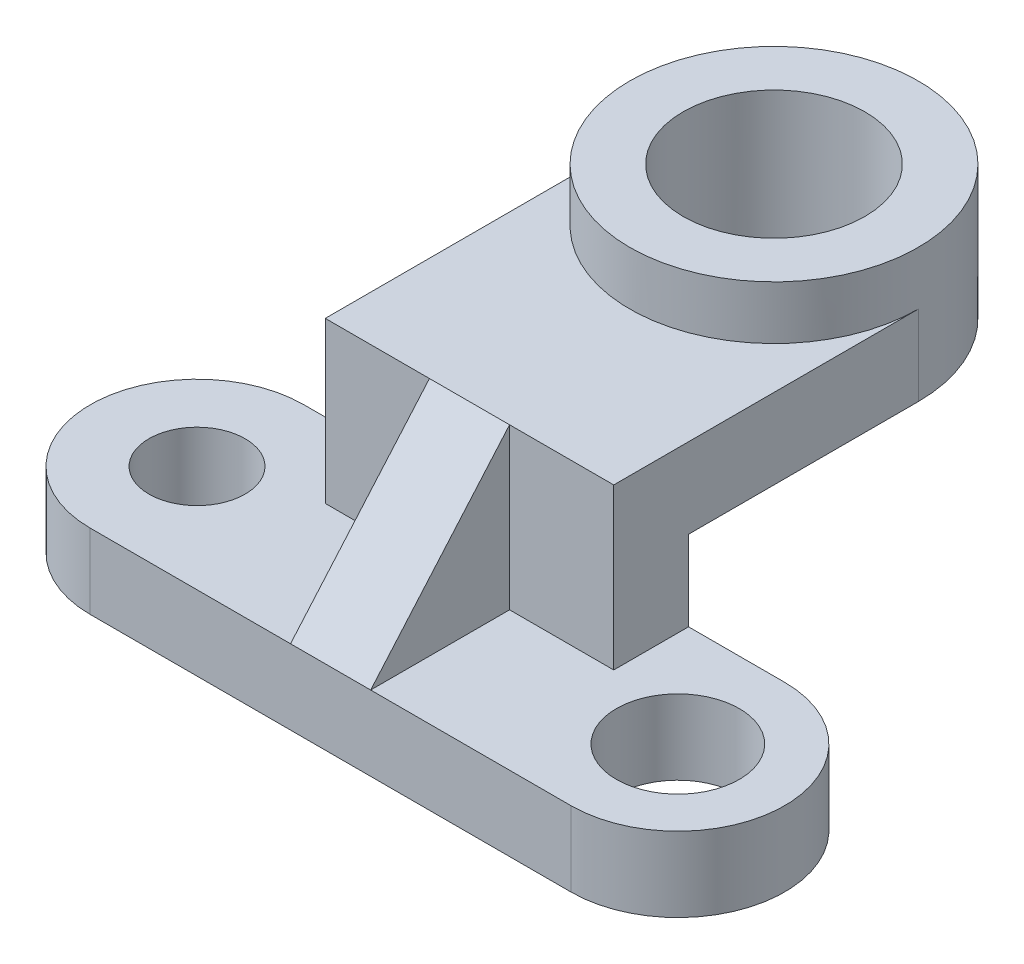
ISO-10303-21;
HEADER;
FILE_DESCRIPTION(('STEP AP214'),'2;1');
FILE_NAME('part.step','',(''),(''),'','','');
FILE_SCHEMA(('AUTOMOTIVE_DESIGN { 1 0 10303 214 1 1 1 1 }'));
ENDSEC;
DATA;
#1=APPLICATION_CONTEXT('core data for automotive mechanical design processes');
#2=APPLICATION_PROTOCOL_DEFINITION('international standard','automotive_design',2000,#1);
#3=PRODUCT_CONTEXT('',#1,'mechanical');
#4=PRODUCT('Part','Part','',(#3));
#5=PRODUCT_RELATED_PRODUCT_CATEGORY('part','',(#4));
#6=PRODUCT_DEFINITION_FORMATION('','',#4);
#7=PRODUCT_DEFINITION_CONTEXT('part definition',#1,'design');
#8=PRODUCT_DEFINITION('design','',#6,#7);
#9=PRODUCT_DEFINITION_SHAPE('','',#8);
#10=(LENGTH_UNIT() NAMED_UNIT(*) SI_UNIT(.MILLI.,.METRE.));
#11=(NAMED_UNIT(*) PLANE_ANGLE_UNIT() SI_UNIT($,.RADIAN.));
#12=(NAMED_UNIT(*) SI_UNIT($,.STERADIAN.) SOLID_ANGLE_UNIT());
#13=UNCERTAINTY_MEASURE_WITH_UNIT(LENGTH_MEASURE(1.E-05),#10,'distance_accuracy_value','');
#14=(GEOMETRIC_REPRESENTATION_CONTEXT(3) GLOBAL_UNCERTAINTY_ASSIGNED_CONTEXT((#13)) GLOBAL_UNIT_ASSIGNED_CONTEXT((#10,
#11,#12)) REPRESENTATION_CONTEXT('',''));
#15=CARTESIAN_POINT('',(0.,0.,0.));
#16=DIRECTION('',(0.,0.,1.));
#17=DIRECTION('',(1.,0.,0.));
#18=AXIS2_PLACEMENT_3D('',#15,#16,#17);
#19=CARTESIAN_POINT('',(0.,28.,0.));
#20=DIRECTION('',(0.,1.,0.));
#21=DIRECTION('',(0.,0.,1.));
#22=AXIS2_PLACEMENT_3D('',#19,#20,#21);
#23=PLANE('',#22);
#24=CARTESIAN_POINT('',(0.,28.,0.));
#25=DIRECTION('',(0.,1.,0.));
#26=DIRECTION('',(0.,0.,1.));
#27=AXIS2_PLACEMENT_3D('',#24,#25,#26);
#28=CIRCLE('',#27,18.);
#29=CARTESIAN_POINT('',(0.,28.,18.));
#30=VERTEX_POINT('',#29);
#31=EDGE_CURVE('E185',#30,#30,#28,.T.);
#32=ORIENTED_EDGE('',*,*,#31,.F.);
#33=EDGE_LOOP('',(#32));
#34=FACE_BOUND('',#33,.T.);
#35=DIRECTION('',(1.,0.,0.));
#36=VECTOR('',#35,1.);
#37=CARTESIAN_POINT('',(0.,28.,40.));
#38=LINE('',#37,#36);
#39=CARTESIAN_POINT('',(0.,28.,40.));
#40=VERTEX_POINT('',#39);
#41=CARTESIAN_POINT('',(75.,28.,40.));
#42=VERTEX_POINT('',#41);
#43=EDGE_CURVE('E203',#40,#42,#38,.T.);
#44=ORIENTED_EDGE('',*,*,#43,.T.);
#45=DIRECTION('',(0.,0.,1.));
#46=VECTOR('',#45,1.);
#47=CARTESIAN_POINT('',(75.,28.,40.));
#48=LINE('',#47,#46);
#49=CARTESIAN_POINT('',(75.,28.,-12.));
#50=VERTEX_POINT('',#49);
#51=EDGE_CURVE('E143',#50,#42,#48,.T.);
#52=ORIENTED_EDGE('',*,*,#51,.F.);
#53=DIRECTION('',(1.,0.,0.));
#54=VECTOR('',#53,1.);
#55=CARTESIAN_POINT('',(36.,28.,-12.));
#56=LINE('',#55,#54);
#57=CARTESIAN_POINT('',(36.,28.,-12.));
#58=VERTEX_POINT('',#57);
#59=EDGE_CURVE('E162',#58,#50,#56,.T.);
#60=ORIENTED_EDGE('',*,*,#59,.F.);
#61=DIRECTION('',(0.,0.,1.));
#62=VECTOR('',#61,1.);
#63=CARTESIAN_POINT('',(36.,28.,-40.));
#64=LINE('',#63,#62);
#65=CARTESIAN_POINT('',(36.,28.,-40.));
#66=VERTEX_POINT('',#65);
#67=EDGE_CURVE('E178',#66,#58,#64,.T.);
#68=ORIENTED_EDGE('',*,*,#67,.F.);
#69=DIRECTION('',(-1.,0.,0.));
#70=VECTOR('',#69,1.);
#71=CARTESIAN_POINT('',(0.,28.,-40.));
#72=LINE('',#71,#70);
#73=CARTESIAN_POINT('',(0.,28.,-40.));
#74=VERTEX_POINT('',#73);
#75=EDGE_CURVE('E208',#66,#74,#72,.T.);
#76=ORIENTED_EDGE('',*,*,#75,.T.);
#77=CARTESIAN_POINT('',(0.,28.,0.));
#78=DIRECTION('',(0.,1.,0.));
#79=DIRECTION('',(0.,0.,1.));
#80=AXIS2_PLACEMENT_3D('',#77,#78,#79);
#81=CIRCLE('',#80,40.);
#82=EDGE_CURVE('E198',#74,#40,#81,.T.);
#83=ORIENTED_EDGE('',*,*,#82,.T.);
#84=EDGE_LOOP('',(#44,#52,#60,#68,#76,#83));
#85=FACE_BOUND('',#84,.T.);
#86=ADVANCED_FACE('F41',(#34,#85),#23,.T.);
#87=CARTESIAN_POINT('',(36.,199.570605447851,-12.));
#88=DIRECTION('',(0.,0.,-1.));
#89=DIRECTION('',(-1.,0.,0.));
#90=AXIS2_PLACEMENT_3D('',#87,#88,#89);
#91=PLANE('',#90);
#92=DIRECTION('',(0.,-1.,0.));
#93=VECTOR('',#92,1.);
#94=CARTESIAN_POINT('',(75.,28.,-12.));
#95=LINE('',#94,#93);
#96=CARTESIAN_POINT('',(75.,88.,-12.));
#97=VERTEX_POINT('',#96);
#98=EDGE_CURVE('E141',#97,#50,#95,.T.);
#99=ORIENTED_EDGE('',*,*,#98,.F.);
#100=DIRECTION('',(1.,0.,0.));
#101=VECTOR('',#100,1.);
#102=CARTESIAN_POINT('',(36.,88.,-12.));
#103=LINE('',#102,#101);
#104=CARTESIAN_POINT('',(36.,88.,-12.));
#105=VERTEX_POINT('',#104);
#106=EDGE_CURVE('E160',#105,#97,#103,.T.);
#107=ORIENTED_EDGE('',*,*,#106,.F.);
#108=DIRECTION('',(0.,-1.,0.));
#109=VECTOR('',#108,1.);
#110=CARTESIAN_POINT('',(36.,199.570605447851,-12.));
#111=LINE('',#110,#109);
#112=EDGE_CURVE('E179',#105,#58,#111,.T.);
#113=ORIENTED_EDGE('',*,*,#112,.T.);
#114=ORIENTED_EDGE('',*,*,#59,.T.);
#115=EDGE_LOOP('',(#99,#107,#113,#114));
#116=FACE_BOUND('',#115,.T.);
#117=ADVANCED_FACE('F158',(#116),#91,.F.);
#118=DIRECTION('',(0.,0.,1.));
#119=VECTOR('',#118,1.);
#120=CARTESIAN_POINT('',(105.,28.,40.));
#121=LINE('',#120,#119);
#122=CARTESIAN_POINT('',(105.,28.,-12.));
#123=VERTEX_POINT('',#122);
#124=CARTESIAN_POINT('',(105.,28.,40.));
#125=VERTEX_POINT('',#124);
#126=EDGE_CURVE('E145',#123,#125,#121,.T.);
#127=ORIENTED_EDGE('',*,*,#126,.T.);
#128=CARTESIAN_POINT('',(180.,28.,40.));
#129=VERTEX_POINT('',#128);
#130=EDGE_CURVE('E201',#125,#129,#38,.T.);
#131=ORIENTED_EDGE('',*,*,#130,.T.);
#132=CARTESIAN_POINT('',(180.,28.,0.));
#133=DIRECTION('',(0.,1.,0.));
#134=DIRECTION('',(0.,0.,1.));
#135=AXIS2_PLACEMENT_3D('',#132,#133,#134);
#136=CIRCLE('',#135,40.);
#137=CARTESIAN_POINT('',(180.,28.,-40.));
#138=VERTEX_POINT('',#137);
#139=EDGE_CURVE('E206',#129,#138,#136,.T.);
#140=ORIENTED_EDGE('',*,*,#139,.T.);
#141=CARTESIAN_POINT('',(144.,28.,-40.));
#142=VERTEX_POINT('',#141);
#143=EDGE_CURVE('E209',#138,#142,#72,.T.);
#144=ORIENTED_EDGE('',*,*,#143,.T.);
#145=DIRECTION('',(0.,0.,-1.));
#146=VECTOR('',#145,1.);
#147=CARTESIAN_POINT('',(144.,28.,-12.));
#148=LINE('',#147,#146);
#149=CARTESIAN_POINT('',(144.,28.,-12.));
#150=VERTEX_POINT('',#149);
#151=EDGE_CURVE('E176',#150,#142,#148,.T.);
#152=ORIENTED_EDGE('',*,*,#151,.F.);
#153=EDGE_CURVE('E64',#123,#150,#56,.T.);
#154=ORIENTED_EDGE('',*,*,#153,.F.);
#155=EDGE_LOOP('',(#127,#131,#140,#144,#152,#154));
#156=FACE_BOUND('',#155,.T.);
#157=CARTESIAN_POINT('',(180.,28.,0.));
#158=DIRECTION('',(0.,1.,0.));
#159=DIRECTION('',(0.,0.,1.));
#160=AXIS2_PLACEMENT_3D('',#157,#158,#159);
#161=CIRCLE('',#160,23.);
#162=CARTESIAN_POINT('',(180.,28.,23.));
#163=VERTEX_POINT('',#162);
#164=EDGE_CURVE('E192',#163,#163,#161,.T.);
#165=ORIENTED_EDGE('',*,*,#164,.F.);
#166=EDGE_LOOP('',(#165));
#167=FACE_BOUND('',#166,.T.);
#168=ADVANCED_FACE('F292',(#156,#167),#23,.T.);
#169=CARTESIAN_POINT('',(0.,0.,0.));
#170=DIRECTION('',(0.,1.,0.));
#171=DIRECTION('',(0.,0.,1.));
#172=AXIS2_PLACEMENT_3D('',#169,#170,#171);
#173=PLANE('',#172);
#174=CARTESIAN_POINT('',(0.,0.,0.));
#175=DIRECTION('',(0.,1.,0.));
#176=DIRECTION('',(0.,0.,1.));
#177=AXIS2_PLACEMENT_3D('',#174,#175,#176);
#178=CIRCLE('',#177,40.);
#179=CARTESIAN_POINT('',(0.,0.,-40.));
#180=VERTEX_POINT('',#179);
#181=CARTESIAN_POINT('',(0.,0.,40.));
#182=VERTEX_POINT('',#181);
#183=EDGE_CURVE('E195',#180,#182,#178,.T.);
#184=ORIENTED_EDGE('',*,*,#183,.F.);
#185=DIRECTION('',(-1.,0.,0.));
#186=VECTOR('',#185,1.);
#187=CARTESIAN_POINT('',(0.,0.,-40.));
#188=LINE('',#187,#186);
#189=CARTESIAN_POINT('',(180.,0.,-40.));
#190=VERTEX_POINT('',#189);
#191=EDGE_CURVE('E202',#190,#180,#188,.T.);
#192=ORIENTED_EDGE('',*,*,#191,.F.);
#193=CARTESIAN_POINT('',(180.,0.,0.));
#194=DIRECTION('',(0.,1.,0.));
#195=DIRECTION('',(0.,0.,1.));
#196=AXIS2_PLACEMENT_3D('',#193,#194,#195);
#197=CIRCLE('',#196,40.);
#198=CARTESIAN_POINT('',(180.,0.,40.));
#199=VERTEX_POINT('',#198);
#200=EDGE_CURVE('E217',#199,#190,#197,.T.);
#201=ORIENTED_EDGE('',*,*,#200,.F.);
#202=DIRECTION('',(1.,0.,0.));
#203=VECTOR('',#202,1.);
#204=CARTESIAN_POINT('',(0.,0.,40.));
#205=LINE('',#204,#203);
#206=EDGE_CURVE('E215',#182,#199,#205,.T.);
#207=ORIENTED_EDGE('',*,*,#206,.F.);
#208=EDGE_LOOP('',(#184,#192,#201,#207));
#209=FACE_BOUND('',#208,.T.);
#210=CARTESIAN_POINT('',(180.,0.,0.));
#211=DIRECTION('',(0.,1.,0.));
#212=DIRECTION('',(0.,0.,1.));
#213=AXIS2_PLACEMENT_3D('',#210,#211,#212);
#214=CIRCLE('',#213,23.);
#215=CARTESIAN_POINT('',(180.,0.,23.));
#216=VERTEX_POINT('',#215);
#217=EDGE_CURVE('E188',#216,#216,#214,.T.);
#218=ORIENTED_EDGE('',*,*,#217,.T.);
#219=EDGE_LOOP('',(#218));
#220=FACE_BOUND('',#219,.T.);
#221=CARTESIAN_POINT('',(0.,0.,0.));
#222=DIRECTION('',(0.,1.,0.));
#223=DIRECTION('',(0.,0.,1.));
#224=AXIS2_PLACEMENT_3D('',#221,#222,#223);
#225=CIRCLE('',#224,18.);
#226=CARTESIAN_POINT('',(0.,0.,18.));
#227=VERTEX_POINT('',#226);
#228=EDGE_CURVE('E189',#227,#227,#225,.T.);
#229=ORIENTED_EDGE('',*,*,#228,.T.);
#230=EDGE_LOOP('',(#229));
#231=FACE_BOUND('',#230,.T.);
#232=ADVANCED_FACE('F236',(#209,#220,#231),#173,.F.);
#233=CARTESIAN_POINT('',(0.,28.,0.));
#234=DIRECTION('',(0.,-1.,0.));
#235=DIRECTION('',(0.,0.,-1.));
#236=AXIS2_PLACEMENT_3D('',#233,#234,#235);
#237=CYLINDRICAL_SURFACE('',#236,40.);
#238=ORIENTED_EDGE('',*,*,#183,.T.);
#239=DIRECTION('',(0.,-1.,0.));
#240=VECTOR('',#239,1.);
#241=CARTESIAN_POINT('',(0.,28.,40.));
#242=LINE('',#241,#240);
#243=EDGE_CURVE('E11',#40,#182,#242,.T.);
#244=ORIENTED_EDGE('',*,*,#243,.F.);
#245=ORIENTED_EDGE('',*,*,#82,.F.);
#246=DIRECTION('',(0.,-1.,0.));
#247=VECTOR('',#246,1.);
#248=CARTESIAN_POINT('',(0.,28.,-40.));
#249=LINE('',#248,#247);
#250=EDGE_CURVE('E212',#74,#180,#249,.T.);
#251=ORIENTED_EDGE('',*,*,#250,.T.);
#252=EDGE_LOOP('',(#238,#244,#245,#251));
#253=FACE_BOUND('',#252,.T.);
#254=ADVANCED_FACE('F43',(#253),#237,.T.);
#255=CARTESIAN_POINT('',(0.,28.,40.));
#256=DIRECTION('',(0.,0.,-1.));
#257=DIRECTION('',(-1.,0.,0.));
#258=AXIS2_PLACEMENT_3D('',#255,#256,#257);
#259=PLANE('',#258);
#260=ORIENTED_EDGE('',*,*,#206,.T.);
#261=DIRECTION('',(0.,-1.,0.));
#262=VECTOR('',#261,1.);
#263=CARTESIAN_POINT('',(180.,28.,40.));
#264=LINE('',#263,#262);
#265=EDGE_CURVE('E49',#129,#199,#264,.T.);
#266=ORIENTED_EDGE('',*,*,#265,.F.);
#267=ORIENTED_EDGE('',*,*,#130,.F.);
#268=DIRECTION('',(1.,0.,0.));
#269=VECTOR('',#268,1.);
#270=CARTESIAN_POINT('',(75.,28.,40.));
#271=LINE('',#270,#269);
#272=EDGE_CURVE('E153',#42,#125,#271,.T.);
#273=ORIENTED_EDGE('',*,*,#272,.F.);
#274=ORIENTED_EDGE('',*,*,#43,.F.);
#275=ORIENTED_EDGE('',*,*,#243,.T.);
#276=EDGE_LOOP('',(#260,#266,#267,#273,#274,#275));
#277=FACE_BOUND('',#276,.T.);
#278=ADVANCED_FACE('F294',(#277),#259,.F.);
#279=CARTESIAN_POINT('',(180.,28.,0.));
#280=DIRECTION('',(0.,-1.,0.));
#281=DIRECTION('',(0.,0.,-1.));
#282=AXIS2_PLACEMENT_3D('',#279,#280,#281);
#283=CYLINDRICAL_SURFACE('',#282,40.);
#284=ORIENTED_EDGE('',*,*,#200,.T.);
#285=DIRECTION('',(0.,-1.,0.));
#286=VECTOR('',#285,1.);
#287=CARTESIAN_POINT('',(180.,28.,-40.));
#288=LINE('',#287,#286);
#289=EDGE_CURVE('E222',#138,#190,#288,.T.);
#290=ORIENTED_EDGE('',*,*,#289,.F.);
#291=ORIENTED_EDGE('',*,*,#139,.F.);
#292=ORIENTED_EDGE('',*,*,#265,.T.);
#293=EDGE_LOOP('',(#284,#290,#291,#292));
#294=FACE_BOUND('',#293,.T.);
#295=ADVANCED_FACE('F229',(#294),#283,.T.);
#296=CARTESIAN_POINT('',(0.,28.,-40.));
#297=DIRECTION('',(0.,0.,1.));
#298=DIRECTION('',(1.,0.,0.));
#299=AXIS2_PLACEMENT_3D('',#296,#297,#298);
#300=PLANE('',#299);
#301=DIRECTION('',(0.,-1.,0.));
#302=VECTOR('',#301,1.);
#303=CARTESIAN_POINT('',(36.,199.570605447851,-40.));
#304=LINE('',#303,#302);
#305=CARTESIAN_POINT('',(36.,58.,-40.));
#306=VERTEX_POINT('',#305);
#307=EDGE_CURVE('E175',#306,#66,#304,.T.);
#308=ORIENTED_EDGE('',*,*,#307,.F.);
#309=DIRECTION('',(-1.,0.,0.));
#310=VECTOR('',#309,1.);
#311=CARTESIAN_POINT('',(144.,58.,-40.));
#312=LINE('',#311,#310);
#313=CARTESIAN_POINT('',(144.,58.,-40.));
#314=VERTEX_POINT('',#313);
#315=EDGE_CURVE('E152',#314,#306,#312,.T.);
#316=ORIENTED_EDGE('',*,*,#315,.F.);
#317=DIRECTION('',(0.,-1.,0.));
#318=VECTOR('',#317,1.);
#319=CARTESIAN_POINT('',(144.,199.570605447851,-40.));
#320=LINE('',#319,#318);
#321=EDGE_CURVE('E173',#314,#142,#320,.T.);
#322=ORIENTED_EDGE('',*,*,#321,.T.);
#323=ORIENTED_EDGE('',*,*,#143,.F.);
#324=ORIENTED_EDGE('',*,*,#289,.T.);
#325=ORIENTED_EDGE('',*,*,#191,.T.);
#326=ORIENTED_EDGE('',*,*,#250,.F.);
#327=ORIENTED_EDGE('',*,*,#75,.F.);
#328=EDGE_LOOP('',(#308,#316,#322,#323,#324,#325,#326,#327));
#329=FACE_BOUND('',#328,.T.);
#330=ADVANCED_FACE('F241',(#329),#300,.F.);
#331=CARTESIAN_POINT('',(180.,28.,0.));
#332=DIRECTION('',(0.,-1.,0.));
#333=DIRECTION('',(0.,0.,-1.));
#334=AXIS2_PLACEMENT_3D('',#331,#332,#333);
#335=CYLINDRICAL_SURFACE('',#334,23.);
#336=ORIENTED_EDGE('',*,*,#164,.T.);
#337=EDGE_LOOP('',(#336));
#338=FACE_BOUND('',#337,.T.);
#339=ORIENTED_EDGE('',*,*,#217,.F.);
#340=EDGE_LOOP('',(#339));
#341=FACE_BOUND('',#340,.T.);
#342=ADVANCED_FACE('F334',(#338,#341),#335,.F.);
#343=CARTESIAN_POINT('',(0.,28.,0.));
#344=DIRECTION('',(0.,-1.,0.));
#345=DIRECTION('',(0.,0.,-1.));
#346=AXIS2_PLACEMENT_3D('',#343,#344,#345);
#347=CYLINDRICAL_SURFACE('',#346,18.);
#348=ORIENTED_EDGE('',*,*,#31,.T.);
#349=EDGE_LOOP('',(#348));
#350=FACE_BOUND('',#349,.T.);
#351=ORIENTED_EDGE('',*,*,#228,.F.);
#352=EDGE_LOOP('',(#351));
#353=FACE_BOUND('',#352,.T.);
#354=ADVANCED_FACE('F392',(#350,#353),#347,.F.);
#355=CARTESIAN_POINT('',(144.,199.570605447851,-12.));
#356=DIRECTION('',(-1.,0.,0.));
#357=DIRECTION('',(0.,0.,1.));
#358=AXIS2_PLACEMENT_3D('',#355,#356,#357);
#359=PLANE('',#358);
#360=DIRECTION('',(0.,0.,-1.));
#361=VECTOR('',#360,1.);
#362=CARTESIAN_POINT('',(144.,88.,-12.));
#363=LINE('',#362,#361);
#364=CARTESIAN_POINT('',(144.,88.,-12.));
#365=VERTEX_POINT('',#364);
#366=CARTESIAN_POINT('',(144.,88.,-126.));
#367=VERTEX_POINT('',#366);
#368=EDGE_CURVE('E167',#365,#367,#363,.T.);
#369=ORIENTED_EDGE('',*,*,#368,.F.);
#370=DIRECTION('',(0.,-1.,0.));
#371=VECTOR('',#370,1.);
#372=CARTESIAN_POINT('',(144.,199.570605447851,-12.));
#373=LINE('',#372,#371);
#374=EDGE_CURVE('E181',#365,#150,#373,.T.);
#375=ORIENTED_EDGE('',*,*,#374,.T.);
#376=ORIENTED_EDGE('',*,*,#151,.T.);
#377=ORIENTED_EDGE('',*,*,#321,.F.);
#378=DIRECTION('',(0.,0.,1.));
#379=VECTOR('',#378,1.);
#380=CARTESIAN_POINT('',(144.,58.,-126.));
#381=LINE('',#380,#379);
#382=CARTESIAN_POINT('',(144.,58.,-126.));
#383=VERTEX_POINT('',#382);
#384=EDGE_CURVE('E262',#383,#314,#381,.T.);
#385=ORIENTED_EDGE('',*,*,#384,.F.);
#386=DIRECTION('',(0.,-1.,0.));
#387=VECTOR('',#386,1.);
#388=CARTESIAN_POINT('',(144.,88.,-126.));
#389=LINE('',#388,#387);
#390=EDGE_CURVE('E277',#367,#383,#389,.T.);
#391=ORIENTED_EDGE('',*,*,#390,.F.);
#392=EDGE_LOOP('',(#369,#375,#376,#377,#385,#391));
#393=FACE_BOUND('',#392,.T.);
#394=ADVANCED_FACE('F288',(#393),#359,.F.);
#395=CARTESIAN_POINT('',(36.,199.570605447851,-40.));
#396=DIRECTION('',(1.,0.,0.));
#397=DIRECTION('',(0.,0.,-1.));
#398=AXIS2_PLACEMENT_3D('',#395,#396,#397);
#399=PLANE('',#398);
#400=DIRECTION('',(0.,0.,1.));
#401=VECTOR('',#400,1.);
#402=CARTESIAN_POINT('',(36.,88.,-40.));
#403=LINE('',#402,#401);
#404=CARTESIAN_POINT('',(36.,88.,-126.));
#405=VERTEX_POINT('',#404);
#406=EDGE_CURVE('E166',#405,#105,#403,.T.);
#407=ORIENTED_EDGE('',*,*,#406,.F.);
#408=DIRECTION('',(0.,-1.,0.));
#409=VECTOR('',#408,1.);
#410=CARTESIAN_POINT('',(36.,88.,-126.));
#411=LINE('',#410,#409);
#412=CARTESIAN_POINT('',(36.,58.,-126.));
#413=VERTEX_POINT('',#412);
#414=EDGE_CURVE('E184',#405,#413,#411,.T.);
#415=ORIENTED_EDGE('',*,*,#414,.T.);
#416=DIRECTION('',(0.,0.,-1.));
#417=VECTOR('',#416,1.);
#418=CARTESIAN_POINT('',(36.,58.,-40.));
#419=LINE('',#418,#417);
#420=EDGE_CURVE('E256',#306,#413,#419,.T.);
#421=ORIENTED_EDGE('',*,*,#420,.F.);
#422=ORIENTED_EDGE('',*,*,#307,.T.);
#423=ORIENTED_EDGE('',*,*,#67,.T.);
#424=ORIENTED_EDGE('',*,*,#112,.F.);
#425=EDGE_LOOP('',(#407,#415,#421,#422,#423,#424));
#426=FACE_BOUND('',#425,.T.);
#427=ADVANCED_FACE('F254',(#426),#399,.F.);
#428=CARTESIAN_POINT('',(105.,88.,-12.));
#429=VERTEX_POINT('',#428);
#430=EDGE_CURVE('E168',#429,#365,#103,.T.);
#431=ORIENTED_EDGE('',*,*,#430,.F.);
#432=DIRECTION('',(0.,-1.,0.));
#433=VECTOR('',#432,1.);
#434=CARTESIAN_POINT('',(105.,28.,-12.));
#435=LINE('',#434,#433);
#436=EDGE_CURVE('E299',#429,#123,#435,.T.);
#437=ORIENTED_EDGE('',*,*,#436,.T.);
#438=ORIENTED_EDGE('',*,*,#153,.T.);
#439=ORIENTED_EDGE('',*,*,#374,.F.);
#440=EDGE_LOOP('',(#431,#437,#438,#439));
#441=FACE_BOUND('',#440,.T.);
#442=ADVANCED_FACE('F302',(#441),#91,.F.);
#443=CARTESIAN_POINT('',(0.,88.,0.));
#444=DIRECTION('',(0.,1.,0.));
#445=DIRECTION('',(0.,0.,1.));
#446=AXIS2_PLACEMENT_3D('',#443,#444,#445);
#447=PLANE('',#446);
#448=ORIENTED_EDGE('',*,*,#106,.T.);
#449=DIRECTION('',(1.,0.,0.));
#450=VECTOR('',#449,1.);
#451=CARTESIAN_POINT('',(75.,88.,-12.));
#452=LINE('',#451,#450);
#453=EDGE_CURVE('E148',#97,#429,#452,.T.);
#454=ORIENTED_EDGE('',*,*,#453,.T.);
#455=ORIENTED_EDGE('',*,*,#430,.T.);
#456=ORIENTED_EDGE('',*,*,#368,.T.);
#457=CARTESIAN_POINT('',(90.,88.,-126.));
#458=DIRECTION('',(0.,1.,0.));
#459=DIRECTION('',(0.,0.,1.));
#460=AXIS2_PLACEMENT_3D('',#457,#458,#459);
#461=CIRCLE('',#460,54.);
#462=EDGE_CURVE('E274',#405,#367,#461,.T.);
#463=ORIENTED_EDGE('',*,*,#462,.F.);
#464=ORIENTED_EDGE('',*,*,#406,.T.);
#465=EDGE_LOOP('',(#448,#454,#455,#456,#463,#464));
#466=FACE_BOUND('',#465,.T.);
#467=ADVANCED_FACE('F164',(#466),#447,.T.);
#468=CARTESIAN_POINT('',(90.,108.,-126.));
#469=DIRECTION('',(0.,-1.,0.));
#470=DIRECTION('',(0.,0.,-1.));
#471=AXIS2_PLACEMENT_3D('',#468,#469,#470);
#472=CYLINDRICAL_SURFACE('',#471,54.);
#473=CARTESIAN_POINT('',(90.,108.,-126.));
#474=DIRECTION('',(0.,1.,0.));
#475=DIRECTION('',(0.,0.,1.));
#476=AXIS2_PLACEMENT_3D('',#473,#474,#475);
#477=CIRCLE('',#476,54.);
#478=CARTESIAN_POINT('',(90.,108.,-72.));
#479=VERTEX_POINT('',#478);
#480=EDGE_CURVE('E271',#479,#479,#477,.T.);
#481=ORIENTED_EDGE('',*,*,#480,.F.);
#482=EDGE_LOOP('',(#481));
#483=FACE_BOUND('',#482,.T.);
#484=CARTESIAN_POINT('',(90.,58.,-126.));
#485=DIRECTION('',(0.,-1.,0.));
#486=DIRECTION('',(0.,0.,-1.));
#487=AXIS2_PLACEMENT_3D('',#484,#485,#486);
#488=CIRCLE('',#487,54.);
#489=EDGE_CURVE('E260',#413,#383,#488,.T.);
#490=ORIENTED_EDGE('',*,*,#489,.F.);
#491=ORIENTED_EDGE('',*,*,#414,.F.);
#492=ORIENTED_EDGE('',*,*,#462,.T.);
#493=ORIENTED_EDGE('',*,*,#390,.T.);
#494=EDGE_LOOP('',(#490,#491,#492,#493));
#495=FACE_BOUND('',#494,.T.);
#496=ADVANCED_FACE('F354',(#483,#495),#472,.T.);
#497=CARTESIAN_POINT('',(90.,108.,-126.));
#498=DIRECTION('',(0.,-1.,0.));
#499=DIRECTION('',(0.,0.,-1.));
#500=AXIS2_PLACEMENT_3D('',#497,#498,#499);
#501=CYLINDRICAL_SURFACE('',#500,34.);
#502=CARTESIAN_POINT('',(90.,108.,-126.));
#503=DIRECTION('',(0.,1.,0.));
#504=DIRECTION('',(0.,0.,1.));
#505=AXIS2_PLACEMENT_3D('',#502,#503,#504);
#506=CIRCLE('',#505,34.);
#507=CARTESIAN_POINT('',(90.,108.,-92.));
#508=VERTEX_POINT('',#507);
#509=EDGE_CURVE('E268',#508,#508,#506,.T.);
#510=ORIENTED_EDGE('',*,*,#509,.T.);
#511=EDGE_LOOP('',(#510));
#512=FACE_BOUND('',#511,.T.);
#513=CARTESIAN_POINT('',(90.,58.,-126.));
#514=DIRECTION('',(0.,-1.,0.));
#515=DIRECTION('',(0.,0.,-1.));
#516=AXIS2_PLACEMENT_3D('',#513,#514,#515);
#517=CIRCLE('',#516,34.);
#518=CARTESIAN_POINT('',(90.,58.,-160.));
#519=VERTEX_POINT('',#518);
#520=EDGE_CURVE('E267',#519,#519,#517,.T.);
#521=ORIENTED_EDGE('',*,*,#520,.T.);
#522=EDGE_LOOP('',(#521));
#523=FACE_BOUND('',#522,.T.);
#524=ADVANCED_FACE('F425',(#512,#523),#501,.F.);
#525=CARTESIAN_POINT('',(0.,108.,0.));
#526=DIRECTION('',(0.,1.,0.));
#527=DIRECTION('',(0.,0.,1.));
#528=AXIS2_PLACEMENT_3D('',#525,#526,#527);
#529=PLANE('',#528);
#530=ORIENTED_EDGE('',*,*,#509,.F.);
#531=EDGE_LOOP('',(#530));
#532=FACE_BOUND('',#531,.T.);
#533=ORIENTED_EDGE('',*,*,#480,.T.);
#534=EDGE_LOOP('',(#533));
#535=FACE_BOUND('',#534,.T.);
#536=ADVANCED_FACE('F415',(#532,#535),#529,.T.);
#537=CARTESIAN_POINT('',(90.,58.,-126.));
#538=DIRECTION('',(0.,-1.,0.));
#539=DIRECTION('',(0.,0.,-1.));
#540=AXIS2_PLACEMENT_3D('',#537,#538,#539);
#541=PLANE('',#540);
#542=ORIENTED_EDGE('',*,*,#520,.F.);
#543=EDGE_LOOP('',(#542));
#544=FACE_BOUND('',#543,.T.);
#545=ORIENTED_EDGE('',*,*,#315,.T.);
#546=ORIENTED_EDGE('',*,*,#420,.T.);
#547=ORIENTED_EDGE('',*,*,#489,.T.);
#548=ORIENTED_EDGE('',*,*,#384,.T.);
#549=EDGE_LOOP('',(#545,#546,#547,#548));
#550=FACE_BOUND('',#549,.T.);
#551=ADVANCED_FACE('F362',(#544,#550),#541,.T.);
#552=CARTESIAN_POINT('',(75.,88.,-12.));
#553=DIRECTION('',(0.,-0.654930538417842,-0.755689082789818));
#554=DIRECTION('',(0.,0.755689082789818,-0.654930538417842));
#555=AXIS2_PLACEMENT_3D('',#552,#553,#554);
#556=PLANE('',#555);
#557=DIRECTION('',(0.,0.755689082789818,-0.654930538417842));
#558=VECTOR('',#557,1.);
#559=CARTESIAN_POINT('',(105.,88.,-12.));
#560=LINE('',#559,#558);
#561=EDGE_CURVE('E56',#125,#429,#560,.T.);
#562=ORIENTED_EDGE('',*,*,#561,.T.);
#563=ORIENTED_EDGE('',*,*,#453,.F.);
#564=DIRECTION('',(0.,0.755689082789818,-0.654930538417842));
#565=VECTOR('',#564,1.);
#566=CARTESIAN_POINT('',(75.,88.,-12.));
#567=LINE('',#566,#565);
#568=EDGE_CURVE('E138',#42,#97,#567,.T.);
#569=ORIENTED_EDGE('',*,*,#568,.F.);
#570=ORIENTED_EDGE('',*,*,#272,.T.);
#571=EDGE_LOOP('',(#562,#563,#569,#570));
#572=FACE_BOUND('',#571,.T.);
#573=ADVANCED_FACE('F149',(#572),#556,.F.);
#574=CARTESIAN_POINT('',(75.,0.,0.));
#575=DIRECTION('',(1.,0.,0.));
#576=DIRECTION('',(0.,0.,-1.));
#577=AXIS2_PLACEMENT_3D('',#574,#575,#576);
#578=PLANE('',#577);
#579=ORIENTED_EDGE('',*,*,#568,.T.);
#580=ORIENTED_EDGE('',*,*,#98,.T.);
#581=ORIENTED_EDGE('',*,*,#51,.T.);
#582=EDGE_LOOP('',(#579,#580,#581));
#583=FACE_BOUND('',#582,.T.);
#584=ADVANCED_FACE('F139',(#583),#578,.F.);
#585=CARTESIAN_POINT('',(105.,0.,0.));
#586=DIRECTION('',(1.,0.,0.));
#587=DIRECTION('',(0.,0.,-1.));
#588=AXIS2_PLACEMENT_3D('',#585,#586,#587);
#589=PLANE('',#588);
#590=ORIENTED_EDGE('',*,*,#561,.F.);
#591=ORIENTED_EDGE('',*,*,#126,.F.);
#592=ORIENTED_EDGE('',*,*,#436,.F.);
#593=EDGE_LOOP('',(#590,#591,#592));
#594=FACE_BOUND('',#593,.T.);
#595=ADVANCED_FACE('F304',(#594),#589,.T.);
#596=CLOSED_SHELL('',(#86,#117,#168,#232,#254,#278,#295,#330,#342,#354,#394,#427,#442,#467,#496,
#524,#536,#551,#573,#584,#595));
#597=MANIFOLD_SOLID_BREP('B2',#596);
#598=ADVANCED_BREP_SHAPE_REPRESENTATION('',(#18,#597),#14);
#599=SHAPE_DEFINITION_REPRESENTATION(#9,#598);
ENDSEC;
END-ISO-10303-21;
